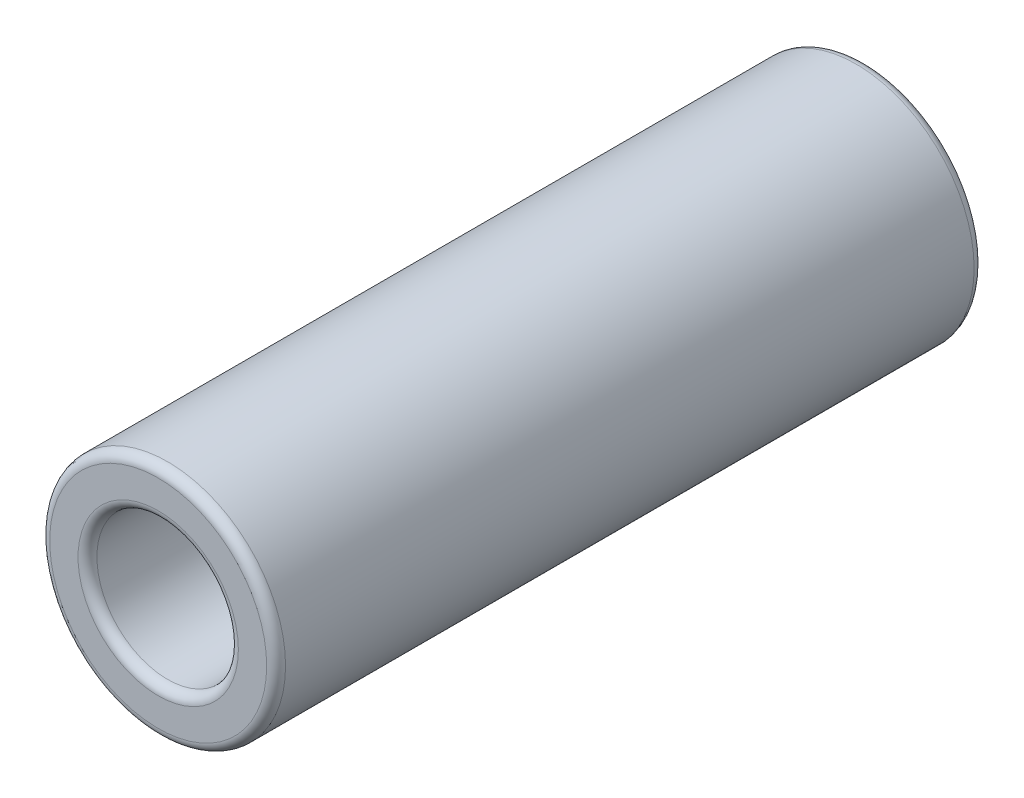
ISO-10303-21;
HEADER;
FILE_DESCRIPTION(('STEP AP214'),'2;1');
FILE_NAME('part.step','',(''),(''),'','','');
FILE_SCHEMA(('AUTOMOTIVE_DESIGN { 1 0 10303 214 1 1 1 1 }'));
ENDSEC;
DATA;
#1=APPLICATION_CONTEXT('core data for automotive mechanical design processes');
#2=APPLICATION_PROTOCOL_DEFINITION('international standard','automotive_design',2000,#1);
#3=PRODUCT_CONTEXT('',#1,'mechanical');
#4=PRODUCT('Part','Part','',(#3));
#5=PRODUCT_RELATED_PRODUCT_CATEGORY('part','',(#4));
#6=PRODUCT_DEFINITION_FORMATION('','',#4);
#7=PRODUCT_DEFINITION_CONTEXT('part definition',#1,'design');
#8=PRODUCT_DEFINITION('design','',#6,#7);
#9=PRODUCT_DEFINITION_SHAPE('','',#8);
#10=(LENGTH_UNIT() NAMED_UNIT(*) SI_UNIT(.MILLI.,.METRE.));
#11=(NAMED_UNIT(*) PLANE_ANGLE_UNIT() SI_UNIT($,.RADIAN.));
#12=(NAMED_UNIT(*) SI_UNIT($,.STERADIAN.) SOLID_ANGLE_UNIT());
#13=UNCERTAINTY_MEASURE_WITH_UNIT(LENGTH_MEASURE(1.E-05),#10,'distance_accuracy_value','');
#14=(GEOMETRIC_REPRESENTATION_CONTEXT(3) GLOBAL_UNCERTAINTY_ASSIGNED_CONTEXT((#13)) GLOBAL_UNIT_ASSIGNED_CONTEXT((#10,
#11,#12)) REPRESENTATION_CONTEXT('',''));
#15=CARTESIAN_POINT('',(0.,0.,0.));
#16=DIRECTION('',(0.,0.,1.));
#17=DIRECTION('',(1.,0.,0.));
#18=AXIS2_PLACEMENT_3D('',#15,#16,#17);
#19=CARTESIAN_POINT('',(0.,0.,15.));
#20=DIRECTION('',(0.,0.,1.));
#21=DIRECTION('',(1.,0.,0.));
#22=AXIS2_PLACEMENT_3D('',#19,#20,#21);
#23=PLANE('',#22);
#24=CARTESIAN_POINT('',(0.,0.,15.));
#25=DIRECTION('',(0.,0.,1.));
#26=DIRECTION('',(1.,0.,0.));
#27=AXIS2_PLACEMENT_3D('',#24,#25,#26);
#28=CIRCLE('',#27,1.7);
#29=CARTESIAN_POINT('',(1.7,0.,15.));
#30=VERTEX_POINT('',#29);
#31=EDGE_CURVE('E10',#30,#30,#28,.F.);
#32=ORIENTED_EDGE('',*,*,#31,.T.);
#33=EDGE_LOOP('',(#32));
#34=FACE_BOUND('',#33,.T.);
#35=CARTESIAN_POINT('',(0.,0.,15.));
#36=DIRECTION('',(0.,0.,1.));
#37=DIRECTION('',(1.,0.,0.));
#38=AXIS2_PLACEMENT_3D('',#35,#36,#37);
#39=CIRCLE('',#38,2.3);
#40=CARTESIAN_POINT('',(2.3,0.,15.));
#41=VERTEX_POINT('',#40);
#42=EDGE_CURVE('E39',#41,#41,#39,.T.);
#43=ORIENTED_EDGE('',*,*,#42,.T.);
#44=EDGE_LOOP('',(#43));
#45=FACE_BOUND('',#44,.T.);
#46=ADVANCED_FACE('F32',(#34,#45),#23,.T.);
#47=CARTESIAN_POINT('',(0.,0.,0.));
#48=DIRECTION('',(0.,0.,1.));
#49=DIRECTION('',(1.,0.,0.));
#50=AXIS2_PLACEMENT_3D('',#47,#48,#49);
#51=PLANE('',#50);
#52=CARTESIAN_POINT('',(0.,0.,0.));
#53=DIRECTION('',(0.,0.,1.));
#54=DIRECTION('',(1.,0.,0.));
#55=AXIS2_PLACEMENT_3D('',#52,#53,#54);
#56=CIRCLE('',#55,2.3);
#57=CARTESIAN_POINT('',(2.3,0.,0.));
#58=VERTEX_POINT('',#57);
#59=EDGE_CURVE('E52',#58,#58,#56,.F.);
#60=ORIENTED_EDGE('',*,*,#59,.T.);
#61=EDGE_LOOP('',(#60));
#62=FACE_BOUND('',#61,.T.);
#63=CARTESIAN_POINT('',(0.,0.,0.));
#64=DIRECTION('',(0.,0.,1.));
#65=DIRECTION('',(1.,0.,0.));
#66=AXIS2_PLACEMENT_3D('',#63,#64,#65);
#67=CIRCLE('',#66,1.7);
#68=CARTESIAN_POINT('',(1.7,0.,0.));
#69=VERTEX_POINT('',#68);
#70=EDGE_CURVE('E55',#69,#69,#67,.T.);
#71=ORIENTED_EDGE('',*,*,#70,.T.);
#72=EDGE_LOOP('',(#71));
#73=FACE_BOUND('',#72,.T.);
#74=ADVANCED_FACE('F76',(#62,#73),#51,.F.);
#75=CARTESIAN_POINT('',(0.,0.,15.));
#76=DIRECTION('',(0.,0.,-1.));
#77=DIRECTION('',(-1.,0.,0.));
#78=AXIS2_PLACEMENT_3D('',#75,#76,#77);
#79=CYLINDRICAL_SURFACE('',#78,2.5);
#80=CARTESIAN_POINT('',(0.,0.,0.200000000000001));
#81=DIRECTION('',(0.,0.,1.));
#82=DIRECTION('',(1.,0.,0.));
#83=AXIS2_PLACEMENT_3D('',#80,#81,#82);
#84=CIRCLE('',#83,2.5);
#85=CARTESIAN_POINT('',(2.5,0.,0.200000000000001));
#86=VERTEX_POINT('',#85);
#87=EDGE_CURVE('E58',#86,#86,#84,.T.);
#88=ORIENTED_EDGE('',*,*,#87,.T.);
#89=EDGE_LOOP('',(#88));
#90=FACE_BOUND('',#89,.T.);
#91=CARTESIAN_POINT('',(0.,0.,14.8));
#92=DIRECTION('',(0.,0.,1.));
#93=DIRECTION('',(1.,0.,0.));
#94=AXIS2_PLACEMENT_3D('',#91,#92,#93);
#95=CIRCLE('',#94,2.5);
#96=CARTESIAN_POINT('',(2.5,0.,14.8));
#97=VERTEX_POINT('',#96);
#98=EDGE_CURVE('E61',#97,#97,#95,.F.);
#99=ORIENTED_EDGE('',*,*,#98,.T.);
#100=EDGE_LOOP('',(#99));
#101=FACE_BOUND('',#100,.T.);
#102=ADVANCED_FACE('F65',(#90,#101),#79,.T.);
#103=CARTESIAN_POINT('',(0.,0.,15.));
#104=DIRECTION('',(0.,0.,-1.));
#105=DIRECTION('',(-1.,0.,0.));
#106=AXIS2_PLACEMENT_3D('',#103,#104,#105);
#107=CYLINDRICAL_SURFACE('',#106,1.5);
#108=CARTESIAN_POINT('',(0.,0.,0.200000000000001));
#109=DIRECTION('',(0.,0.,1.));
#110=DIRECTION('',(1.,0.,0.));
#111=AXIS2_PLACEMENT_3D('',#108,#109,#110);
#112=CIRCLE('',#111,1.5);
#113=CARTESIAN_POINT('',(1.5,0.,0.200000000000001));
#114=VERTEX_POINT('',#113);
#115=EDGE_CURVE('E43',#114,#114,#112,.F.);
#116=ORIENTED_EDGE('',*,*,#115,.T.);
#117=EDGE_LOOP('',(#116));
#118=FACE_BOUND('',#117,.T.);
#119=CARTESIAN_POINT('',(0.,0.,14.8));
#120=DIRECTION('',(0.,0.,1.));
#121=DIRECTION('',(1.,0.,0.));
#122=AXIS2_PLACEMENT_3D('',#119,#120,#121);
#123=CIRCLE('',#122,1.5);
#124=CARTESIAN_POINT('',(1.5,0.,14.8));
#125=VERTEX_POINT('',#124);
#126=EDGE_CURVE('E47',#125,#125,#123,.T.);
#127=ORIENTED_EDGE('',*,*,#126,.T.);
#128=EDGE_LOOP('',(#127));
#129=FACE_BOUND('',#128,.T.);
#130=ADVANCED_FACE('F84',(#118,#129),#107,.F.);
#131=CARTESIAN_POINT('',(0.,0.,0.200000000000001));
#132=DIRECTION('',(0.,0.,1.));
#133=DIRECTION('',(1.,0.,0.));
#134=AXIS2_PLACEMENT_3D('',#131,#132,#133);
#135=TOROIDAL_SURFACE('',#134,2.3,0.2);
#136=ORIENTED_EDGE('',*,*,#59,.F.);
#137=EDGE_LOOP('',(#136));
#138=FACE_BOUND('',#137,.T.);
#139=ORIENTED_EDGE('',*,*,#87,.F.);
#140=EDGE_LOOP('',(#139));
#141=FACE_BOUND('',#140,.T.);
#142=ADVANCED_FACE('F89',(#138,#141),#135,.T.);
#143=CARTESIAN_POINT('',(0.,0.,0.200000000000001));
#144=DIRECTION('',(0.,0.,1.));
#145=DIRECTION('',(1.,0.,0.));
#146=AXIS2_PLACEMENT_3D('',#143,#144,#145);
#147=TOROIDAL_SURFACE('',#146,1.7,0.2);
#148=ORIENTED_EDGE('',*,*,#115,.F.);
#149=EDGE_LOOP('',(#148));
#150=FACE_BOUND('',#149,.T.);
#151=ORIENTED_EDGE('',*,*,#70,.F.);
#152=EDGE_LOOP('',(#151));
#153=FACE_BOUND('',#152,.T.);
#154=ADVANCED_FACE('F73',(#150,#153),#147,.T.);
#155=CARTESIAN_POINT('',(0.,0.,14.8));
#156=DIRECTION('',(0.,0.,1.));
#157=DIRECTION('',(1.,0.,0.));
#158=AXIS2_PLACEMENT_3D('',#155,#156,#157);
#159=TOROIDAL_SURFACE('',#158,1.7,0.2);
#160=ORIENTED_EDGE('',*,*,#31,.F.);
#161=EDGE_LOOP('',(#160));
#162=FACE_BOUND('',#161,.T.);
#163=ORIENTED_EDGE('',*,*,#126,.F.);
#164=EDGE_LOOP('',(#163));
#165=FACE_BOUND('',#164,.T.);
#166=ADVANCED_FACE('F69',(#162,#165),#159,.T.);
#167=CARTESIAN_POINT('',(0.,0.,14.8));
#168=DIRECTION('',(0.,0.,1.));
#169=DIRECTION('',(1.,0.,0.));
#170=AXIS2_PLACEMENT_3D('',#167,#168,#169);
#171=TOROIDAL_SURFACE('',#170,2.3,0.2);
#172=ORIENTED_EDGE('',*,*,#98,.F.);
#173=EDGE_LOOP('',(#172));
#174=FACE_BOUND('',#173,.T.);
#175=ORIENTED_EDGE('',*,*,#42,.F.);
#176=EDGE_LOOP('',(#175));
#177=FACE_BOUND('',#176,.T.);
#178=ADVANCED_FACE('F34',(#174,#177),#171,.T.);
#179=CLOSED_SHELL('',(#46,#74,#102,#130,#142,#154,#166,#178));
#180=MANIFOLD_SOLID_BREP('B2',#179);
#181=ADVANCED_BREP_SHAPE_REPRESENTATION('',(#18,#180),#14);
#182=SHAPE_DEFINITION_REPRESENTATION(#9,#181);
ENDSEC;
END-ISO-10303-21;
